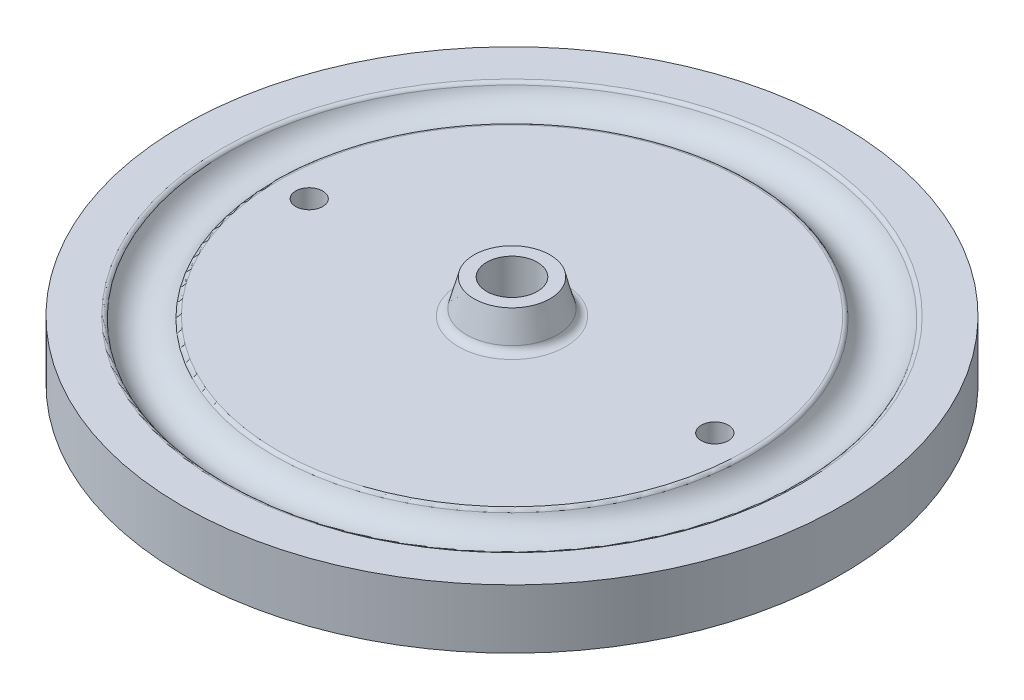
ISO-10303-21;
HEADER;
FILE_DESCRIPTION(('STEP AP214'),'2;1');
FILE_NAME('part.step','',(''),(''),'','','');
FILE_SCHEMA(('AUTOMOTIVE_DESIGN { 1 0 10303 214 1 1 1 1 }'));
ENDSEC;
DATA;
#1=APPLICATION_CONTEXT('core data for automotive mechanical design processes');
#2=APPLICATION_PROTOCOL_DEFINITION('international standard','automotive_design',2000,#1);
#3=PRODUCT_CONTEXT('',#1,'mechanical');
#4=PRODUCT('Part','Part','',(#3));
#5=PRODUCT_RELATED_PRODUCT_CATEGORY('part','',(#4));
#6=PRODUCT_DEFINITION_FORMATION('','',#4);
#7=PRODUCT_DEFINITION_CONTEXT('part definition',#1,'design');
#8=PRODUCT_DEFINITION('design','',#6,#7);
#9=PRODUCT_DEFINITION_SHAPE('','',#8);
#10=(LENGTH_UNIT() NAMED_UNIT(*) SI_UNIT(.MILLI.,.METRE.));
#11=(NAMED_UNIT(*) PLANE_ANGLE_UNIT() SI_UNIT($,.RADIAN.));
#12=(NAMED_UNIT(*) SI_UNIT($,.STERADIAN.) SOLID_ANGLE_UNIT());
#13=UNCERTAINTY_MEASURE_WITH_UNIT(LENGTH_MEASURE(1.E-05),#10,'distance_accuracy_value','');
#14=(GEOMETRIC_REPRESENTATION_CONTEXT(3) GLOBAL_UNCERTAINTY_ASSIGNED_CONTEXT((#13)) GLOBAL_UNIT_ASSIGNED_CONTEXT((#10,
#11,#12)) REPRESENTATION_CONTEXT('',''));
#15=CARTESIAN_POINT('',(0.,0.,0.));
#16=DIRECTION('',(0.,0.,1.));
#17=DIRECTION('',(1.,0.,0.));
#18=AXIS2_PLACEMENT_3D('',#15,#16,#17);
#19=CARTESIAN_POINT('',(0.,-7.,0.));
#20=DIRECTION('',(0.,1.,0.));
#21=DIRECTION('',(0.,0.,1.));
#22=AXIS2_PLACEMENT_3D('',#19,#20,#21);
#23=CYLINDRICAL_SURFACE('',#22,39.);
#24=CARTESIAN_POINT('',(0.,-7.,0.));
#25=DIRECTION('',(0.,1.,0.));
#26=DIRECTION('',(0.,0.,1.));
#27=AXIS2_PLACEMENT_3D('',#24,#25,#26);
#28=CIRCLE('',#27,39.);
#29=CARTESIAN_POINT('',(0.,-7.,39.));
#30=VERTEX_POINT('',#29);
#31=EDGE_CURVE('E218',#30,#30,#28,.T.);
#32=ORIENTED_EDGE('',*,*,#31,.T.);
#33=EDGE_LOOP('',(#32));
#34=FACE_BOUND('',#33,.T.);
#35=CARTESIAN_POINT('',(0.,0.,0.));
#36=DIRECTION('',(0.,1.,0.));
#37=DIRECTION('',(0.,0.,1.));
#38=AXIS2_PLACEMENT_3D('',#35,#36,#37);
#39=CIRCLE('',#38,39.);
#40=CARTESIAN_POINT('',(0.,0.,39.));
#41=VERTEX_POINT('',#40);
#42=EDGE_CURVE('E230',#41,#41,#39,.T.);
#43=ORIENTED_EDGE('',*,*,#42,.F.);
#44=EDGE_LOOP('',(#43));
#45=FACE_BOUND('',#44,.T.);
#46=ADVANCED_FACE('F35',(#34,#45),#23,.T.);
#47=CARTESIAN_POINT('',(33.9870554062488,0.,0.));
#48=DIRECTION('',(0.,1.,0.));
#49=DIRECTION('',(0.,0.,1.));
#50=AXIS2_PLACEMENT_3D('',#47,#48,#49);
#51=PLANE('',#50);
#52=CARTESIAN_POINT('',(0.,0.,0.));
#53=DIRECTION('',(0.,1.,0.));
#54=DIRECTION('',(0.,0.,1.));
#55=AXIS2_PLACEMENT_3D('',#52,#53,#54);
#56=CIRCLE('',#55,34.327536626395);
#57=CARTESIAN_POINT('',(0.,0.,34.327536626395));
#58=VERTEX_POINT('',#57);
#59=EDGE_CURVE('E239',#58,#58,#56,.F.);
#60=ORIENTED_EDGE('',*,*,#59,.T.);
#61=EDGE_LOOP('',(#60));
#62=FACE_BOUND('',#61,.T.);
#63=ORIENTED_EDGE('',*,*,#42,.T.);
#64=EDGE_LOOP('',(#63));
#65=FACE_BOUND('',#64,.T.);
#66=ADVANCED_FACE('F260',(#62,#65),#51,.T.);
#67=CARTESIAN_POINT('',(0.,1.,0.));
#68=DIRECTION('',(0.,1.,0.));
#69=DIRECTION('',(0.,0.,1.));
#70=AXIS2_PLACEMENT_3D('',#67,#68,#69);
#71=TOROIDAL_SURFACE('',#70,31.,3.15);
#72=CARTESIAN_POINT('',(0.,-0.29452054794522,0.));
#73=DIRECTION('',(0.,1.,0.));
#74=DIRECTION('',(0.,0.,1.));
#75=AXIS2_PLACEMENT_3D('',#72,#73,#74);
#76=CIRCLE('',#75,33.8717096912724);
#77=CARTESIAN_POINT('',(0.,-0.29452054794522,33.8717096912724));
#78=VERTEX_POINT('',#77);
#79=EDGE_CURVE('E236',#78,#78,#76,.T.);
#80=ORIENTED_EDGE('',*,*,#79,.T.);
#81=EDGE_LOOP('',(#80));
#82=FACE_BOUND('',#81,.T.);
#83=CARTESIAN_POINT('',(0.,-0.294520547945199,0.));
#84=DIRECTION('',(0.,1.,0.));
#85=DIRECTION('',(0.,0.,1.));
#86=AXIS2_PLACEMENT_3D('',#83,#84,#85);
#87=CIRCLE('',#86,28.1282903087276);
#88=CARTESIAN_POINT('',(0.,-0.294520547945199,28.1282903087276));
#89=VERTEX_POINT('',#88);
#90=EDGE_CURVE('E233',#89,#89,#87,.F.);
#91=ORIENTED_EDGE('',*,*,#90,.T.);
#92=EDGE_LOOP('',(#91));
#93=FACE_BOUND('',#92,.T.);
#94=ADVANCED_FACE('F266',(#82,#93),#71,.F.);
#95=CARTESIAN_POINT('',(0.,0.,0.));
#96=DIRECTION('',(0.,1.,0.));
#97=DIRECTION('',(0.,0.,1.));
#98=AXIS2_PLACEMENT_3D('',#95,#96,#97);
#99=PLANE('',#98);
#100=CARTESIAN_POINT('',(0.,0.,0.));
#101=DIRECTION('',(0.,1.,0.));
#102=DIRECTION('',(0.,0.,1.));
#103=AXIS2_PLACEMENT_3D('',#100,#101,#102);
#104=CIRCLE('',#103,6.33912375770345);
#105=CARTESIAN_POINT('',(0.,0.,6.33912375770345));
#106=VERTEX_POINT('',#105);
#107=EDGE_CURVE('E11',#106,#106,#104,.F.);
#108=ORIENTED_EDGE('',*,*,#107,.T.);
#109=EDGE_LOOP('',(#108));
#110=FACE_BOUND('',#109,.T.);
#111=CARTESIAN_POINT('',(0.,0.,0.));
#112=DIRECTION('',(0.,1.,0.));
#113=DIRECTION('',(0.,0.,1.));
#114=AXIS2_PLACEMENT_3D('',#111,#112,#113);
#115=CIRCLE('',#114,27.672463373605);
#116=CARTESIAN_POINT('',(0.,0.,27.672463373605));
#117=VERTEX_POINT('',#116);
#118=EDGE_CURVE('E242',#117,#117,#115,.T.);
#119=ORIENTED_EDGE('',*,*,#118,.T.);
#120=EDGE_LOOP('',(#119));
#121=FACE_BOUND('',#120,.T.);
#122=CARTESIAN_POINT('',(-24.,0.,0.));
#123=DIRECTION('',(0.,1.,0.));
#124=DIRECTION('',(0.,0.,1.));
#125=AXIS2_PLACEMENT_3D('',#122,#123,#124);
#126=CIRCLE('',#125,1.59999999999999);
#127=CARTESIAN_POINT('',(-24.,0.,1.59999999999999));
#128=VERTEX_POINT('',#127);
#129=EDGE_CURVE('E300',#128,#128,#126,.T.);
#130=ORIENTED_EDGE('',*,*,#129,.F.);
#131=EDGE_LOOP('',(#130));
#132=FACE_BOUND('',#131,.T.);
#133=CARTESIAN_POINT('',(24.,0.,0.));
#134=DIRECTION('',(0.,1.,0.));
#135=DIRECTION('',(0.,0.,1.));
#136=AXIS2_PLACEMENT_3D('',#133,#134,#135);
#137=CIRCLE('',#136,1.59999999999999);
#138=CARTESIAN_POINT('',(24.,0.,1.59999999999999));
#139=VERTEX_POINT('',#138);
#140=EDGE_CURVE('E303',#139,#139,#137,.T.);
#141=ORIENTED_EDGE('',*,*,#140,.F.);
#142=EDGE_LOOP('',(#141));
#143=FACE_BOUND('',#142,.T.);
#144=ADVANCED_FACE('F287',(#110,#121,#132,#143),#99,.T.);
#145=CARTESIAN_POINT('',(39.,-7.,0.));
#146=DIRECTION('',(0.,-1.,0.));
#147=DIRECTION('',(0.,0.,-1.));
#148=AXIS2_PLACEMENT_3D('',#145,#146,#147);
#149=PLANE('',#148);
#150=CARTESIAN_POINT('',(0.,-7.,0.));
#151=DIRECTION('',(0.,1.,0.));
#152=DIRECTION('',(0.,0.,1.));
#153=AXIS2_PLACEMENT_3D('',#150,#151,#152);
#154=CIRCLE('',#153,2.99999999999999);
#155=CARTESIAN_POINT('',(0.,-7.,2.99999999999999));
#156=VERTEX_POINT('',#155);
#157=EDGE_CURVE('E309',#156,#156,#154,.T.);
#158=ORIENTED_EDGE('',*,*,#157,.T.);
#159=EDGE_LOOP('',(#158));
#160=FACE_BOUND('',#159,.T.);
#161=DIRECTION('',(0.,0.,1.));
#162=VECTOR('',#161,1.);
#163=CARTESIAN_POINT('',(-21.05,-7.,-1.7031832941094));
#164=LINE('',#163,#162);
#165=CARTESIAN_POINT('',(-21.05,-7.,-1.7031832941094));
#166=VERTEX_POINT('',#165);
#167=CARTESIAN_POINT('',(-21.05,-7.,1.70318329410939));
#168=VERTEX_POINT('',#167);
#169=EDGE_CURVE('E50',#166,#168,#164,.T.);
#170=ORIENTED_EDGE('',*,*,#169,.F.);
#171=DIRECTION('',(0.866025403784439,0.,0.5));
#172=VECTOR('',#171,1.);
#173=CARTESIAN_POINT('',(-24.,-7.,-3.40636658821879));
#174=LINE('',#173,#172);
#175=CARTESIAN_POINT('',(-24.,-7.,-3.40636658821879));
#176=VERTEX_POINT('',#175);
#177=EDGE_CURVE('E145',#176,#166,#174,.T.);
#178=ORIENTED_EDGE('',*,*,#177,.F.);
#179=DIRECTION('',(0.866025403784438,0.,-0.500000000000001));
#180=VECTOR('',#179,1.);
#181=CARTESIAN_POINT('',(-26.95,-7.,-1.70318329410939));
#182=LINE('',#181,#180);
#183=CARTESIAN_POINT('',(-26.95,-7.,-1.70318329410939));
#184=VERTEX_POINT('',#183);
#185=EDGE_CURVE('E148',#184,#176,#182,.T.);
#186=ORIENTED_EDGE('',*,*,#185,.F.);
#187=DIRECTION('',(0.,0.,-1.));
#188=VECTOR('',#187,1.);
#189=CARTESIAN_POINT('',(-26.95,-7.,1.70318329410939));
#190=LINE('',#189,#188);
#191=CARTESIAN_POINT('',(-26.95,-7.,1.70318329410939));
#192=VERTEX_POINT('',#191);
#193=EDGE_CURVE('E167',#192,#184,#190,.T.);
#194=ORIENTED_EDGE('',*,*,#193,.F.);
#195=DIRECTION('',(-0.866025403784438,0.,-0.500000000000001));
#196=VECTOR('',#195,1.);
#197=CARTESIAN_POINT('',(-24.,-7.,3.40636658821879));
#198=LINE('',#197,#196);
#199=CARTESIAN_POINT('',(-24.,-7.,3.40636658821879));
#200=VERTEX_POINT('',#199);
#201=EDGE_CURVE('E164',#200,#192,#198,.T.);
#202=ORIENTED_EDGE('',*,*,#201,.F.);
#203=DIRECTION('',(-0.866025403784438,0.,0.500000000000001));
#204=VECTOR('',#203,1.);
#205=CARTESIAN_POINT('',(-21.05,-7.,1.70318329410939));
#206=LINE('',#205,#204);
#207=EDGE_CURVE('E162',#168,#200,#206,.T.);
#208=ORIENTED_EDGE('',*,*,#207,.F.);
#209=EDGE_LOOP('',(#170,#178,#186,#194,#202,#208));
#210=FACE_BOUND('',#209,.T.);
#211=DIRECTION('',(0.866025403784438,0.,0.500000000000001));
#212=VECTOR('',#211,1.);
#213=CARTESIAN_POINT('',(24.,-7.,-3.40636658821879));
#214=LINE('',#213,#212);
#215=CARTESIAN_POINT('',(24.,-7.,-3.40636658821879));
#216=VERTEX_POINT('',#215);
#217=CARTESIAN_POINT('',(26.95,-7.,-1.70318329410939));
#218=VERTEX_POINT('',#217);
#219=EDGE_CURVE('E58',#216,#218,#214,.T.);
#220=ORIENTED_EDGE('',*,*,#219,.F.);
#221=DIRECTION('',(0.866025403784439,0.,-0.5));
#222=VECTOR('',#221,1.);
#223=CARTESIAN_POINT('',(21.05,-7.,-1.7031832941094));
#224=LINE('',#223,#222);
#225=CARTESIAN_POINT('',(21.05,-7.,-1.7031832941094));
#226=VERTEX_POINT('',#225);
#227=EDGE_CURVE('E185',#226,#216,#224,.T.);
#228=ORIENTED_EDGE('',*,*,#227,.F.);
#229=DIRECTION('',(0.,0.,-1.));
#230=VECTOR('',#229,1.);
#231=CARTESIAN_POINT('',(21.05,-7.,1.70318329410939));
#232=LINE('',#231,#230);
#233=CARTESIAN_POINT('',(21.05,-7.,1.70318329410939));
#234=VERTEX_POINT('',#233);
#235=EDGE_CURVE('E211',#234,#226,#232,.T.);
#236=ORIENTED_EDGE('',*,*,#235,.F.);
#237=DIRECTION('',(-0.866025403784438,0.,-0.500000000000001));
#238=VECTOR('',#237,1.);
#239=CARTESIAN_POINT('',(24.,-7.,3.40636658821879));
#240=LINE('',#239,#238);
#241=CARTESIAN_POINT('',(24.,-7.,3.40636658821879));
#242=VERTEX_POINT('',#241);
#243=EDGE_CURVE('E208',#242,#234,#240,.T.);
#244=ORIENTED_EDGE('',*,*,#243,.F.);
#245=DIRECTION('',(-0.866025403784438,0.,0.500000000000001));
#246=VECTOR('',#245,1.);
#247=CARTESIAN_POINT('',(26.95,-7.,1.70318329410939));
#248=LINE('',#247,#246);
#249=CARTESIAN_POINT('',(26.95,-7.,1.70318329410939));
#250=VERTEX_POINT('',#249);
#251=EDGE_CURVE('E205',#250,#242,#248,.T.);
#252=ORIENTED_EDGE('',*,*,#251,.F.);
#253=DIRECTION('',(0.,0.,1.));
#254=VECTOR('',#253,1.);
#255=CARTESIAN_POINT('',(26.95,-7.,-1.70318329410939));
#256=LINE('',#255,#254);
#257=EDGE_CURVE('E202',#218,#250,#256,.T.);
#258=ORIENTED_EDGE('',*,*,#257,.F.);
#259=EDGE_LOOP('',(#220,#228,#236,#244,#252,#258));
#260=FACE_BOUND('',#259,.T.);
#261=ORIENTED_EDGE('',*,*,#31,.F.);
#262=EDGE_LOOP('',(#261));
#263=FACE_BOUND('',#262,.T.);
#264=ADVANCED_FACE('F294',(#160,#210,#260,#263),#149,.T.);
#265=CARTESIAN_POINT('',(24.,-4.,-3.40636658821879));
#266=DIRECTION('',(0.500000000000001,0.,-0.866025403784438));
#267=DIRECTION('',(-0.866025403784438,0.,-0.500000000000001));
#268=AXIS2_PLACEMENT_3D('',#265,#266,#267);
#269=PLANE('',#268);
#270=ORIENTED_EDGE('',*,*,#219,.T.);
#271=DIRECTION('',(0.,-1.,0.));
#272=VECTOR('',#271,1.);
#273=CARTESIAN_POINT('',(26.95,-4.,-1.70318329410939));
#274=LINE('',#273,#272);
#275=CARTESIAN_POINT('',(26.95,-4.,-1.70318329410939));
#276=VERTEX_POINT('',#275);
#277=EDGE_CURVE('E200',#276,#218,#274,.T.);
#278=ORIENTED_EDGE('',*,*,#277,.F.);
#279=DIRECTION('',(0.866025403784438,0.,0.500000000000001));
#280=VECTOR('',#279,1.);
#281=CARTESIAN_POINT('',(24.,-4.,-3.40636658821879));
#282=LINE('',#281,#280);
#283=CARTESIAN_POINT('',(24.,-4.,-3.40636658821879));
#284=VERTEX_POINT('',#283);
#285=EDGE_CURVE('E181',#284,#276,#282,.T.);
#286=ORIENTED_EDGE('',*,*,#285,.F.);
#287=DIRECTION('',(0.,-1.,0.));
#288=VECTOR('',#287,1.);
#289=CARTESIAN_POINT('',(24.,-4.,-3.40636658821879));
#290=LINE('',#289,#288);
#291=EDGE_CURVE('E216',#284,#216,#290,.T.);
#292=ORIENTED_EDGE('',*,*,#291,.T.);
#293=EDGE_LOOP('',(#270,#278,#286,#292));
#294=FACE_BOUND('',#293,.T.);
#295=ADVANCED_FACE('F363',(#294),#269,.F.);
#296=CARTESIAN_POINT('',(21.05,-4.,-1.7031832941094));
#297=DIRECTION('',(-0.5,0.,-0.866025403784439));
#298=DIRECTION('',(-0.866025403784439,0.,0.5));
#299=AXIS2_PLACEMENT_3D('',#296,#297,#298);
#300=PLANE('',#299);
#301=ORIENTED_EDGE('',*,*,#227,.T.);
#302=ORIENTED_EDGE('',*,*,#291,.F.);
#303=DIRECTION('',(0.866025403784439,0.,-0.5));
#304=VECTOR('',#303,1.);
#305=CARTESIAN_POINT('',(21.05,-4.,-1.7031832941094));
#306=LINE('',#305,#304);
#307=CARTESIAN_POINT('',(21.05,-4.,-1.7031832941094));
#308=VERTEX_POINT('',#307);
#309=EDGE_CURVE('E197',#308,#284,#306,.T.);
#310=ORIENTED_EDGE('',*,*,#309,.F.);
#311=DIRECTION('',(0.,-1.,0.));
#312=VECTOR('',#311,1.);
#313=CARTESIAN_POINT('',(21.05,-4.,-1.7031832941094));
#314=LINE('',#313,#312);
#315=EDGE_CURVE('E219',#308,#226,#314,.T.);
#316=ORIENTED_EDGE('',*,*,#315,.T.);
#317=EDGE_LOOP('',(#301,#302,#310,#316));
#318=FACE_BOUND('',#317,.T.);
#319=ADVANCED_FACE('F359',(#318),#300,.F.);
#320=CARTESIAN_POINT('',(21.05,-4.,1.70318329410939));
#321=DIRECTION('',(-1.,0.,0.));
#322=DIRECTION('',(0.,0.,1.));
#323=AXIS2_PLACEMENT_3D('',#320,#321,#322);
#324=PLANE('',#323);
#325=ORIENTED_EDGE('',*,*,#235,.T.);
#326=ORIENTED_EDGE('',*,*,#315,.F.);
#327=DIRECTION('',(0.,0.,-1.));
#328=VECTOR('',#327,1.);
#329=CARTESIAN_POINT('',(21.05,-4.,1.70318329410939));
#330=LINE('',#329,#328);
#331=CARTESIAN_POINT('',(21.05,-4.,1.70318329410939));
#332=VERTEX_POINT('',#331);
#333=EDGE_CURVE('E194',#332,#308,#330,.T.);
#334=ORIENTED_EDGE('',*,*,#333,.F.);
#335=DIRECTION('',(0.,-1.,0.));
#336=VECTOR('',#335,1.);
#337=CARTESIAN_POINT('',(21.05,-4.,1.70318329410939));
#338=LINE('',#337,#336);
#339=EDGE_CURVE('E221',#332,#234,#338,.T.);
#340=ORIENTED_EDGE('',*,*,#339,.T.);
#341=EDGE_LOOP('',(#325,#326,#334,#340));
#342=FACE_BOUND('',#341,.T.);
#343=ADVANCED_FACE('F362',(#342),#324,.F.);
#344=CARTESIAN_POINT('',(24.,-4.,3.40636658821879));
#345=DIRECTION('',(-0.500000000000001,0.,0.866025403784438));
#346=DIRECTION('',(0.866025403784438,0.,0.500000000000001));
#347=AXIS2_PLACEMENT_3D('',#344,#345,#346);
#348=PLANE('',#347);
#349=ORIENTED_EDGE('',*,*,#243,.T.);
#350=ORIENTED_EDGE('',*,*,#339,.F.);
#351=DIRECTION('',(-0.866025403784438,0.,-0.500000000000001));
#352=VECTOR('',#351,1.);
#353=CARTESIAN_POINT('',(24.,-4.,3.40636658821879));
#354=LINE('',#353,#352);
#355=CARTESIAN_POINT('',(24.,-4.,3.40636658821879));
#356=VERTEX_POINT('',#355);
#357=EDGE_CURVE('E191',#356,#332,#354,.T.);
#358=ORIENTED_EDGE('',*,*,#357,.F.);
#359=DIRECTION('',(0.,-1.,0.));
#360=VECTOR('',#359,1.);
#361=CARTESIAN_POINT('',(24.,-4.,3.40636658821879));
#362=LINE('',#361,#360);
#363=EDGE_CURVE('E223',#356,#242,#362,.T.);
#364=ORIENTED_EDGE('',*,*,#363,.T.);
#365=EDGE_LOOP('',(#349,#350,#358,#364));
#366=FACE_BOUND('',#365,.T.);
#367=ADVANCED_FACE('F367',(#366),#348,.F.);
#368=CARTESIAN_POINT('',(26.95,-4.,1.70318329410939));
#369=DIRECTION('',(0.500000000000001,0.,0.866025403784438));
#370=DIRECTION('',(0.866025403784438,0.,-0.500000000000001));
#371=AXIS2_PLACEMENT_3D('',#368,#369,#370);
#372=PLANE('',#371);
#373=ORIENTED_EDGE('',*,*,#251,.T.);
#374=ORIENTED_EDGE('',*,*,#363,.F.);
#375=DIRECTION('',(-0.866025403784438,0.,0.500000000000001));
#376=VECTOR('',#375,1.);
#377=CARTESIAN_POINT('',(26.95,-4.,1.70318329410939));
#378=LINE('',#377,#376);
#379=CARTESIAN_POINT('',(26.95,-4.,1.70318329410939));
#380=VERTEX_POINT('',#379);
#381=EDGE_CURVE('E188',#380,#356,#378,.T.);
#382=ORIENTED_EDGE('',*,*,#381,.F.);
#383=DIRECTION('',(0.,-1.,0.));
#384=VECTOR('',#383,1.);
#385=CARTESIAN_POINT('',(26.95,-4.,1.70318329410939));
#386=LINE('',#385,#384);
#387=EDGE_CURVE('E225',#380,#250,#386,.T.);
#388=ORIENTED_EDGE('',*,*,#387,.T.);
#389=EDGE_LOOP('',(#373,#374,#382,#388));
#390=FACE_BOUND('',#389,.T.);
#391=ADVANCED_FACE('F371',(#390),#372,.F.);
#392=CARTESIAN_POINT('',(26.95,-4.,-1.70318329410939));
#393=DIRECTION('',(1.,0.,0.));
#394=DIRECTION('',(0.,0.,-1.));
#395=AXIS2_PLACEMENT_3D('',#392,#393,#394);
#396=PLANE('',#395);
#397=ORIENTED_EDGE('',*,*,#257,.T.);
#398=ORIENTED_EDGE('',*,*,#387,.F.);
#399=DIRECTION('',(0.,0.,1.));
#400=VECTOR('',#399,1.);
#401=CARTESIAN_POINT('',(26.95,-4.,-1.70318329410939));
#402=LINE('',#401,#400);
#403=EDGE_CURVE('E184',#276,#380,#402,.T.);
#404=ORIENTED_EDGE('',*,*,#403,.F.);
#405=ORIENTED_EDGE('',*,*,#277,.T.);
#406=EDGE_LOOP('',(#397,#398,#404,#405));
#407=FACE_BOUND('',#406,.T.);
#408=ADVANCED_FACE('F357',(#407),#396,.F.);
#409=CARTESIAN_POINT('',(0.,-4.,0.));
#410=DIRECTION('',(0.,-1.,0.));
#411=DIRECTION('',(0.,0.,-1.));
#412=AXIS2_PLACEMENT_3D('',#409,#410,#411);
#413=PLANE('',#412);
#414=CARTESIAN_POINT('',(24.,-4.,0.));
#415=DIRECTION('',(0.,-1.,0.));
#416=DIRECTION('',(0.,0.,-1.));
#417=AXIS2_PLACEMENT_3D('',#414,#415,#416);
#418=CIRCLE('',#417,1.59999999999999);
#419=CARTESIAN_POINT('',(24.,-4.,-1.59999999999999));
#420=VERTEX_POINT('',#419);
#421=EDGE_CURVE('E306',#420,#420,#418,.T.);
#422=ORIENTED_EDGE('',*,*,#421,.F.);
#423=EDGE_LOOP('',(#422));
#424=FACE_BOUND('',#423,.T.);
#425=ORIENTED_EDGE('',*,*,#285,.T.);
#426=ORIENTED_EDGE('',*,*,#403,.T.);
#427=ORIENTED_EDGE('',*,*,#381,.T.);
#428=ORIENTED_EDGE('',*,*,#357,.T.);
#429=ORIENTED_EDGE('',*,*,#333,.T.);
#430=ORIENTED_EDGE('',*,*,#309,.T.);
#431=EDGE_LOOP('',(#425,#426,#427,#428,#429,#430));
#432=FACE_BOUND('',#431,.T.);
#433=ADVANCED_FACE('F354',(#424,#432),#413,.T.);
#434=CARTESIAN_POINT('',(-21.05,-4.,-1.7031832941094));
#435=DIRECTION('',(1.,0.,0.));
#436=DIRECTION('',(0.,0.,-1.));
#437=AXIS2_PLACEMENT_3D('',#434,#435,#436);
#438=PLANE('',#437);
#439=ORIENTED_EDGE('',*,*,#169,.T.);
#440=DIRECTION('',(0.,-1.,0.));
#441=VECTOR('',#440,1.);
#442=CARTESIAN_POINT('',(-21.05,-4.,1.70318329410939));
#443=LINE('',#442,#441);
#444=CARTESIAN_POINT('',(-21.05,-4.,1.70318329410939));
#445=VERTEX_POINT('',#444);
#446=EDGE_CURVE('E122',#445,#168,#443,.T.);
#447=ORIENTED_EDGE('',*,*,#446,.F.);
#448=DIRECTION('',(0.,0.,1.));
#449=VECTOR('',#448,1.);
#450=CARTESIAN_POINT('',(-21.05,-4.,-1.7031832941094));
#451=LINE('',#450,#449);
#452=CARTESIAN_POINT('',(-21.05,-4.,-1.7031832941094));
#453=VERTEX_POINT('',#452);
#454=EDGE_CURVE('E126',#453,#445,#451,.T.);
#455=ORIENTED_EDGE('',*,*,#454,.F.);
#456=DIRECTION('',(0.,-1.,0.));
#457=VECTOR('',#456,1.);
#458=CARTESIAN_POINT('',(-21.05,-4.,-1.7031832941094));
#459=LINE('',#458,#457);
#460=EDGE_CURVE('E172',#453,#166,#459,.T.);
#461=ORIENTED_EDGE('',*,*,#460,.T.);
#462=EDGE_LOOP('',(#439,#447,#455,#461));
#463=FACE_BOUND('',#462,.T.);
#464=ADVANCED_FACE('F124',(#463),#438,.F.);
#465=CARTESIAN_POINT('',(-24.,-4.,-3.40636658821879));
#466=DIRECTION('',(0.5,0.,-0.866025403784439));
#467=DIRECTION('',(-0.866025403784439,0.,-0.5));
#468=AXIS2_PLACEMENT_3D('',#465,#466,#467);
#469=PLANE('',#468);
#470=ORIENTED_EDGE('',*,*,#177,.T.);
#471=ORIENTED_EDGE('',*,*,#460,.F.);
#472=DIRECTION('',(0.866025403784439,0.,0.5));
#473=VECTOR('',#472,1.);
#474=CARTESIAN_POINT('',(-24.,-4.,-3.40636658821879));
#475=LINE('',#474,#473);
#476=CARTESIAN_POINT('',(-24.,-4.,-3.40636658821879));
#477=VERTEX_POINT('',#476);
#478=EDGE_CURVE('E132',#477,#453,#475,.T.);
#479=ORIENTED_EDGE('',*,*,#478,.F.);
#480=DIRECTION('',(0.,-1.,0.));
#481=VECTOR('',#480,1.);
#482=CARTESIAN_POINT('',(-24.,-4.,-3.40636658821879));
#483=LINE('',#482,#481);
#484=EDGE_CURVE('E174',#477,#176,#483,.T.);
#485=ORIENTED_EDGE('',*,*,#484,.T.);
#486=EDGE_LOOP('',(#470,#471,#479,#485));
#487=FACE_BOUND('',#486,.T.);
#488=ADVANCED_FACE('F334',(#487),#469,.F.);
#489=CARTESIAN_POINT('',(-26.95,-4.,-1.70318329410939));
#490=DIRECTION('',(-0.500000000000001,0.,-0.866025403784438));
#491=DIRECTION('',(-0.866025403784438,0.,0.500000000000001));
#492=AXIS2_PLACEMENT_3D('',#489,#490,#491);
#493=PLANE('',#492);
#494=ORIENTED_EDGE('',*,*,#185,.T.);
#495=ORIENTED_EDGE('',*,*,#484,.F.);
#496=DIRECTION('',(0.866025403784438,0.,-0.500000000000001));
#497=VECTOR('',#496,1.);
#498=CARTESIAN_POINT('',(-26.95,-4.,-1.70318329410939));
#499=LINE('',#498,#497);
#500=CARTESIAN_POINT('',(-26.95,-4.,-1.70318329410939));
#501=VERTEX_POINT('',#500);
#502=EDGE_CURVE('E158',#501,#477,#499,.T.);
#503=ORIENTED_EDGE('',*,*,#502,.F.);
#504=DIRECTION('',(0.,-1.,0.));
#505=VECTOR('',#504,1.);
#506=CARTESIAN_POINT('',(-26.95,-4.,-1.70318329410939));
#507=LINE('',#506,#505);
#508=EDGE_CURVE('E176',#501,#184,#507,.T.);
#509=ORIENTED_EDGE('',*,*,#508,.T.);
#510=EDGE_LOOP('',(#494,#495,#503,#509));
#511=FACE_BOUND('',#510,.T.);
#512=ADVANCED_FACE('F337',(#511),#493,.F.);
#513=CARTESIAN_POINT('',(-26.95,-4.,1.70318329410939));
#514=DIRECTION('',(-1.,0.,0.));
#515=DIRECTION('',(0.,0.,1.));
#516=AXIS2_PLACEMENT_3D('',#513,#514,#515);
#517=PLANE('',#516);
#518=ORIENTED_EDGE('',*,*,#193,.T.);
#519=ORIENTED_EDGE('',*,*,#508,.F.);
#520=DIRECTION('',(0.,0.,-1.));
#521=VECTOR('',#520,1.);
#522=CARTESIAN_POINT('',(-26.95,-4.,1.70318329410939));
#523=LINE('',#522,#521);
#524=CARTESIAN_POINT('',(-26.95,-4.,1.70318329410939));
#525=VERTEX_POINT('',#524);
#526=EDGE_CURVE('E155',#525,#501,#523,.T.);
#527=ORIENTED_EDGE('',*,*,#526,.F.);
#528=DIRECTION('',(0.,-1.,0.));
#529=VECTOR('',#528,1.);
#530=CARTESIAN_POINT('',(-26.95,-4.,1.70318329410939));
#531=LINE('',#530,#529);
#532=EDGE_CURVE('E178',#525,#192,#531,.T.);
#533=ORIENTED_EDGE('',*,*,#532,.T.);
#534=EDGE_LOOP('',(#518,#519,#527,#533));
#535=FACE_BOUND('',#534,.T.);
#536=ADVANCED_FACE('F341',(#535),#517,.F.);
#537=CARTESIAN_POINT('',(-24.,-4.,3.40636658821879));
#538=DIRECTION('',(-0.500000000000001,0.,0.866025403784438));
#539=DIRECTION('',(0.866025403784438,0.,0.500000000000001));
#540=AXIS2_PLACEMENT_3D('',#537,#538,#539);
#541=PLANE('',#540);
#542=ORIENTED_EDGE('',*,*,#201,.T.);
#543=ORIENTED_EDGE('',*,*,#532,.F.);
#544=DIRECTION('',(-0.866025403784438,0.,-0.500000000000001));
#545=VECTOR('',#544,1.);
#546=CARTESIAN_POINT('',(-24.,-4.,3.40636658821879));
#547=LINE('',#546,#545);
#548=CARTESIAN_POINT('',(-24.,-4.,3.40636658821879));
#549=VERTEX_POINT('',#548);
#550=EDGE_CURVE('E140',#549,#525,#547,.T.);
#551=ORIENTED_EDGE('',*,*,#550,.F.);
#552=DIRECTION('',(0.,-1.,0.));
#553=VECTOR('',#552,1.);
#554=CARTESIAN_POINT('',(-24.,-4.,3.40636658821879));
#555=LINE('',#554,#553);
#556=EDGE_CURVE('E131',#549,#200,#555,.T.);
#557=ORIENTED_EDGE('',*,*,#556,.T.);
#558=EDGE_LOOP('',(#542,#543,#551,#557));
#559=FACE_BOUND('',#558,.T.);
#560=ADVANCED_FACE('F345',(#559),#541,.F.);
#561=CARTESIAN_POINT('',(-21.05,-4.,1.70318329410939));
#562=DIRECTION('',(0.500000000000001,0.,0.866025403784438));
#563=DIRECTION('',(0.866025403784438,0.,-0.500000000000001));
#564=AXIS2_PLACEMENT_3D('',#561,#562,#563);
#565=PLANE('',#564);
#566=ORIENTED_EDGE('',*,*,#207,.T.);
#567=ORIENTED_EDGE('',*,*,#556,.F.);
#568=DIRECTION('',(-0.866025403784438,0.,0.500000000000001));
#569=VECTOR('',#568,1.);
#570=CARTESIAN_POINT('',(-21.05,-4.,1.70318329410939));
#571=LINE('',#570,#569);
#572=EDGE_CURVE('E135',#445,#549,#571,.T.);
#573=ORIENTED_EDGE('',*,*,#572,.F.);
#574=ORIENTED_EDGE('',*,*,#446,.T.);
#575=EDGE_LOOP('',(#566,#567,#573,#574));
#576=FACE_BOUND('',#575,.T.);
#577=ADVANCED_FACE('F136',(#576),#565,.F.);
#578=CARTESIAN_POINT('',(0.,-4.,0.));
#579=DIRECTION('',(0.,-1.,0.));
#580=DIRECTION('',(0.,0.,-1.));
#581=AXIS2_PLACEMENT_3D('',#578,#579,#580);
#582=PLANE('',#581);
#583=CARTESIAN_POINT('',(-24.,-4.,0.));
#584=DIRECTION('',(0.,-1.,0.));
#585=DIRECTION('',(0.,0.,-1.));
#586=AXIS2_PLACEMENT_3D('',#583,#584,#585);
#587=CIRCLE('',#586,1.59999999999999);
#588=CARTESIAN_POINT('',(-24.,-4.,-1.59999999999999));
#589=VERTEX_POINT('',#588);
#590=EDGE_CURVE('E568',#589,#589,#587,.T.);
#591=ORIENTED_EDGE('',*,*,#590,.F.);
#592=EDGE_LOOP('',(#591));
#593=FACE_BOUND('',#592,.T.);
#594=ORIENTED_EDGE('',*,*,#454,.T.);
#595=ORIENTED_EDGE('',*,*,#572,.T.);
#596=ORIENTED_EDGE('',*,*,#550,.T.);
#597=ORIENTED_EDGE('',*,*,#526,.T.);
#598=ORIENTED_EDGE('',*,*,#502,.T.);
#599=ORIENTED_EDGE('',*,*,#478,.T.);
#600=EDGE_LOOP('',(#594,#595,#596,#597,#598,#599));
#601=FACE_BOUND('',#600,.T.);
#602=ADVANCED_FACE('F142',(#593,#601),#582,.T.);
#603=CARTESIAN_POINT('',(0.,4.,0.));
#604=DIRECTION('',(0.,-1.,0.));
#605=DIRECTION('',(0.,0.,-1.));
#606=AXIS2_PLACEMENT_3D('',#603,#604,#605);
#607=CONICAL_SURFACE('',#606,4.5,0.261799387799149);
#608=CARTESIAN_POINT('',(0.,0.741180954897479,0.));
#609=DIRECTION('',(0.,-1.,0.));
#610=DIRECTION('',(0.,0.,-1.));
#611=AXIS2_PLACEMENT_3D('',#608,#609,#610);
#612=CIRCLE('',#611,5.37319793141438);
#613=CARTESIAN_POINT('',(0.,0.741180954897479,-5.37319793141438));
#614=VERTEX_POINT('',#613);
#615=EDGE_CURVE('E43',#614,#614,#612,.F.);
#616=ORIENTED_EDGE('',*,*,#615,.T.);
#617=EDGE_LOOP('',(#616));
#618=FACE_BOUND('',#617,.T.);
#619=CARTESIAN_POINT('',(0.,4.,0.));
#620=DIRECTION('',(0.,1.,0.));
#621=DIRECTION('',(0.,0.,1.));
#622=AXIS2_PLACEMENT_3D('',#619,#620,#621);
#623=CIRCLE('',#622,4.5);
#624=CARTESIAN_POINT('',(0.,4.,4.5));
#625=VERTEX_POINT('',#624);
#626=EDGE_CURVE('E151',#625,#625,#623,.T.);
#627=ORIENTED_EDGE('',*,*,#626,.F.);
#628=EDGE_LOOP('',(#627));
#629=FACE_BOUND('',#628,.T.);
#630=ADVANCED_FACE('F247',(#618,#629),#607,.T.);
#631=CARTESIAN_POINT('',(0.,4.,0.));
#632=DIRECTION('',(0.,1.,0.));
#633=DIRECTION('',(0.,0.,1.));
#634=AXIS2_PLACEMENT_3D('',#631,#632,#633);
#635=PLANE('',#634);
#636=CARTESIAN_POINT('',(0.,4.,0.));
#637=DIRECTION('',(0.,1.,0.));
#638=DIRECTION('',(0.,0.,1.));
#639=AXIS2_PLACEMENT_3D('',#636,#637,#638);
#640=CIRCLE('',#639,2.99999999999999);
#641=CARTESIAN_POINT('',(0.,4.,2.99999999999999));
#642=VERTEX_POINT('',#641);
#643=EDGE_CURVE('E305',#642,#642,#640,.T.);
#644=ORIENTED_EDGE('',*,*,#643,.F.);
#645=EDGE_LOOP('',(#644));
#646=FACE_BOUND('',#645,.T.);
#647=ORIENTED_EDGE('',*,*,#626,.T.);
#648=EDGE_LOOP('',(#647));
#649=FACE_BOUND('',#648,.T.);
#650=ADVANCED_FACE('F320',(#646,#649),#635,.T.);
#651=CARTESIAN_POINT('',(0.,4.,0.));
#652=DIRECTION('',(0.,1.,0.));
#653=DIRECTION('',(0.,0.,1.));
#654=AXIS2_PLACEMENT_3D('',#651,#652,#653);
#655=CYLINDRICAL_SURFACE('',#654,2.99999999999999);
#656=ORIENTED_EDGE('',*,*,#157,.F.);
#657=EDGE_LOOP('',(#656));
#658=FACE_BOUND('',#657,.T.);
#659=ORIENTED_EDGE('',*,*,#643,.T.);
#660=EDGE_LOOP('',(#659));
#661=FACE_BOUND('',#660,.T.);
#662=ADVANCED_FACE('F327',(#658,#661),#655,.F.);
#663=CARTESIAN_POINT('',(24.,-4.,0.));
#664=DIRECTION('',(0.,-1.,0.));
#665=DIRECTION('',(0.,0.,-1.));
#666=AXIS2_PLACEMENT_3D('',#663,#664,#665);
#667=CYLINDRICAL_SURFACE('',#666,1.59999999999999);
#668=ORIENTED_EDGE('',*,*,#140,.T.);
#669=EDGE_LOOP('',(#668));
#670=FACE_BOUND('',#669,.T.);
#671=ORIENTED_EDGE('',*,*,#421,.T.);
#672=EDGE_LOOP('',(#671));
#673=FACE_BOUND('',#672,.T.);
#674=ADVANCED_FACE('F278',(#670,#673),#667,.F.);
#675=CARTESIAN_POINT('',(-24.,-4.,0.));
#676=DIRECTION('',(0.,-1.,0.));
#677=DIRECTION('',(0.,0.,-1.));
#678=AXIS2_PLACEMENT_3D('',#675,#676,#677);
#679=CYLINDRICAL_SURFACE('',#678,1.59999999999999);
#680=ORIENTED_EDGE('',*,*,#129,.T.);
#681=EDGE_LOOP('',(#680));
#682=FACE_BOUND('',#681,.T.);
#683=ORIENTED_EDGE('',*,*,#590,.T.);
#684=EDGE_LOOP('',(#683));
#685=FACE_BOUND('',#684,.T.);
#686=ADVANCED_FACE('F273',(#682,#685),#679,.F.);
#687=CARTESIAN_POINT('',(0.,-0.500000000000001,0.));
#688=DIRECTION('',(0.,1.,0.));
#689=DIRECTION('',(0.,0.,1.));
#690=AXIS2_PLACEMENT_3D('',#687,#688,#689);
#691=TOROIDAL_SURFACE('',#690,34.327536626395,0.5);
#692=ORIENTED_EDGE('',*,*,#59,.F.);
#693=EDGE_LOOP('',(#692));
#694=FACE_BOUND('',#693,.T.);
#695=ORIENTED_EDGE('',*,*,#79,.F.);
#696=EDGE_LOOP('',(#695));
#697=FACE_BOUND('',#696,.T.);
#698=ADVANCED_FACE('F256',(#694,#697),#691,.T.);
#699=CARTESIAN_POINT('',(0.,-0.5,0.));
#700=DIRECTION('',(0.,-1.,0.));
#701=DIRECTION('',(0.,0.,-1.));
#702=AXIS2_PLACEMENT_3D('',#699,#700,#701);
#703=TOROIDAL_SURFACE('',#702,27.672463373605,0.5);
#704=ORIENTED_EDGE('',*,*,#90,.F.);
#705=EDGE_LOOP('',(#704));
#706=FACE_BOUND('',#705,.T.);
#707=ORIENTED_EDGE('',*,*,#118,.F.);
#708=EDGE_LOOP('',(#707));
#709=FACE_BOUND('',#708,.T.);
#710=ADVANCED_FACE('F251',(#706,#709),#703,.T.);
#711=CARTESIAN_POINT('',(0.,1.,0.));
#712=DIRECTION('',(0.,1.,0.));
#713=DIRECTION('',(0.,0.,1.));
#714=AXIS2_PLACEMENT_3D('',#711,#712,#713);
#715=TOROIDAL_SURFACE('',#714,6.33912375770345,1.);
#716=ORIENTED_EDGE('',*,*,#107,.F.);
#717=EDGE_LOOP('',(#716));
#718=FACE_BOUND('',#717,.T.);
#719=ORIENTED_EDGE('',*,*,#615,.F.);
#720=EDGE_LOOP('',(#719));
#721=FACE_BOUND('',#720,.T.);
#722=ADVANCED_FACE('F37',(#718,#721),#715,.F.);
#723=CLOSED_SHELL('',(#46,#66,#94,#144,#264,#295,#319,#343,#367,#391,#408,#433,#464,#488,#512,
#536,#560,#577,#602,#630,#650,#662,#674,#686,#698,#710,#722));
#724=MANIFOLD_SOLID_BREP('B2',#723);
#725=ADVANCED_BREP_SHAPE_REPRESENTATION('',(#18,#724),#14);
#726=SHAPE_DEFINITION_REPRESENTATION(#9,#725);
ENDSEC;
END-ISO-10303-21;
